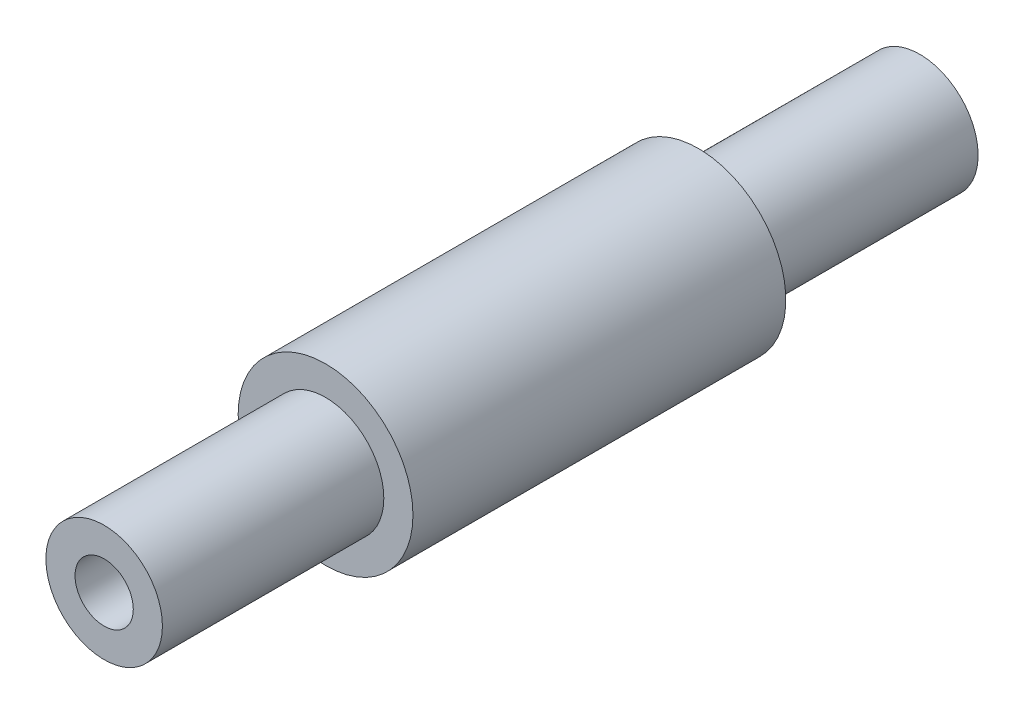
ISO-10303-21;
HEADER;
FILE_DESCRIPTION(('STEP AP214'),'2;1');
FILE_NAME('part.step','',(''),(''),'','','');
FILE_SCHEMA(('AUTOMOTIVE_DESIGN { 1 0 10303 214 1 1 1 1 }'));
ENDSEC;
DATA;
#1=APPLICATION_CONTEXT('core data for automotive mechanical design processes');
#2=APPLICATION_PROTOCOL_DEFINITION('international standard','automotive_design',2000,#1);
#3=PRODUCT_CONTEXT('',#1,'mechanical');
#4=PRODUCT('Part','Part','',(#3));
#5=PRODUCT_RELATED_PRODUCT_CATEGORY('part','',(#4));
#6=PRODUCT_DEFINITION_FORMATION('','',#4);
#7=PRODUCT_DEFINITION_CONTEXT('part definition',#1,'design');
#8=PRODUCT_DEFINITION('design','',#6,#7);
#9=PRODUCT_DEFINITION_SHAPE('','',#8);
#10=(LENGTH_UNIT() NAMED_UNIT(*) SI_UNIT(.MILLI.,.METRE.));
#11=(NAMED_UNIT(*) PLANE_ANGLE_UNIT() SI_UNIT($,.RADIAN.));
#12=(NAMED_UNIT(*) SI_UNIT($,.STERADIAN.) SOLID_ANGLE_UNIT());
#13=UNCERTAINTY_MEASURE_WITH_UNIT(LENGTH_MEASURE(1.E-05),#10,'distance_accuracy_value','');
#14=(GEOMETRIC_REPRESENTATION_CONTEXT(3) GLOBAL_UNCERTAINTY_ASSIGNED_CONTEXT((#13)) GLOBAL_UNIT_ASSIGNED_CONTEXT((#10,
#11,#12)) REPRESENTATION_CONTEXT('',''));
#15=CARTESIAN_POINT('',(0.,0.,0.));
#16=DIRECTION('',(0.,0.,1.));
#17=DIRECTION('',(1.,0.,0.));
#18=AXIS2_PLACEMENT_3D('',#15,#16,#17);
#19=CARTESIAN_POINT('',(0.,0.,70.));
#20=DIRECTION('',(0.,0.,-1.));
#21=DIRECTION('',(-1.,0.,0.));
#22=AXIS2_PLACEMENT_3D('',#19,#20,#21);
#23=CYLINDRICAL_SURFACE('',#22,7.5);
#24=CARTESIAN_POINT('',(0.,0.,19.));
#25=DIRECTION('',(0.,0.,-1.));
#26=DIRECTION('',(-1.,0.,0.));
#27=AXIS2_PLACEMENT_3D('',#24,#25,#26);
#28=CIRCLE('',#27,7.5);
#29=CARTESIAN_POINT('',(-7.5,0.,19.));
#30=VERTEX_POINT('',#29);
#31=EDGE_CURVE('E10',#30,#30,#28,.T.);
#32=ORIENTED_EDGE('',*,*,#31,.F.);
#33=EDGE_LOOP('',(#32));
#34=FACE_BOUND('',#33,.T.);
#35=CARTESIAN_POINT('',(0.,0.,51.));
#36=DIRECTION('',(0.,0.,1.));
#37=DIRECTION('',(1.,0.,0.));
#38=AXIS2_PLACEMENT_3D('',#35,#36,#37);
#39=CIRCLE('',#38,7.5);
#40=CARTESIAN_POINT('',(7.5,0.,51.));
#41=VERTEX_POINT('',#40);
#42=EDGE_CURVE('E34',#41,#41,#39,.T.);
#43=ORIENTED_EDGE('',*,*,#42,.F.);
#44=EDGE_LOOP('',(#43));
#45=FACE_BOUND('',#44,.T.);
#46=ADVANCED_FACE('F31',(#34,#45),#23,.T.);
#47=CARTESIAN_POINT('',(0.,0.,19.));
#48=DIRECTION('',(0.,0.,-1.));
#49=DIRECTION('',(-1.,0.,0.));
#50=AXIS2_PLACEMENT_3D('',#47,#48,#49);
#51=PLANE('',#50);
#52=CARTESIAN_POINT('',(0.,0.,19.));
#53=DIRECTION('',(0.,0.,-1.));
#54=DIRECTION('',(-1.,0.,0.));
#55=AXIS2_PLACEMENT_3D('',#52,#53,#54);
#56=CIRCLE('',#55,5.);
#57=CARTESIAN_POINT('',(-5.,0.,19.));
#58=VERTEX_POINT('',#57);
#59=EDGE_CURVE('E38',#58,#58,#56,.T.);
#60=ORIENTED_EDGE('',*,*,#59,.F.);
#61=EDGE_LOOP('',(#60));
#62=FACE_BOUND('',#61,.T.);
#63=ORIENTED_EDGE('',*,*,#31,.T.);
#64=EDGE_LOOP('',(#63));
#65=FACE_BOUND('',#64,.T.);
#66=ADVANCED_FACE('F83',(#62,#65),#51,.T.);
#67=CARTESIAN_POINT('',(0.,0.,19.));
#68=DIRECTION('',(0.,0.,-1.));
#69=DIRECTION('',(-1.,0.,0.));
#70=AXIS2_PLACEMENT_3D('',#67,#68,#69);
#71=CYLINDRICAL_SURFACE('',#70,5.);
#72=ORIENTED_EDGE('',*,*,#59,.T.);
#73=EDGE_LOOP('',(#72));
#74=FACE_BOUND('',#73,.T.);
#75=CARTESIAN_POINT('',(0.,0.,0.));
#76=DIRECTION('',(0.,0.,-1.));
#77=DIRECTION('',(-1.,0.,0.));
#78=AXIS2_PLACEMENT_3D('',#75,#76,#77);
#79=CIRCLE('',#78,5.);
#80=CARTESIAN_POINT('',(-5.,0.,0.));
#81=VERTEX_POINT('',#80);
#82=EDGE_CURVE('E42',#81,#81,#79,.T.);
#83=ORIENTED_EDGE('',*,*,#82,.F.);
#84=EDGE_LOOP('',(#83));
#85=FACE_BOUND('',#84,.T.);
#86=ADVANCED_FACE('F79',(#74,#85),#71,.T.);
#87=CARTESIAN_POINT('',(0.,0.,0.));
#88=DIRECTION('',(0.,0.,1.));
#89=DIRECTION('',(1.,0.,0.));
#90=AXIS2_PLACEMENT_3D('',#87,#88,#89);
#91=PLANE('',#90);
#92=CARTESIAN_POINT('',(0.,0.,0.));
#93=DIRECTION('',(0.,0.,-1.));
#94=DIRECTION('',(-1.,0.,0.));
#95=AXIS2_PLACEMENT_3D('',#92,#93,#94);
#96=CIRCLE('',#95,2.5);
#97=CARTESIAN_POINT('',(-2.5,0.,0.));
#98=VERTEX_POINT('',#97);
#99=EDGE_CURVE('E60',#98,#98,#96,.T.);
#100=ORIENTED_EDGE('',*,*,#99,.F.);
#101=EDGE_LOOP('',(#100));
#102=FACE_BOUND('',#101,.T.);
#103=ORIENTED_EDGE('',*,*,#82,.T.);
#104=EDGE_LOOP('',(#103));
#105=FACE_BOUND('',#104,.T.);
#106=ADVANCED_FACE('F75',(#102,#105),#91,.F.);
#107=CARTESIAN_POINT('',(0.,0.,51.));
#108=DIRECTION('',(0.,0.,1.));
#109=DIRECTION('',(1.,0.,0.));
#110=AXIS2_PLACEMENT_3D('',#107,#108,#109);
#111=PLANE('',#110);
#112=CARTESIAN_POINT('',(0.,0.,51.));
#113=DIRECTION('',(0.,0.,1.));
#114=DIRECTION('',(1.,0.,0.));
#115=AXIS2_PLACEMENT_3D('',#112,#113,#114);
#116=CIRCLE('',#115,5.);
#117=CARTESIAN_POINT('',(5.,0.,51.));
#118=VERTEX_POINT('',#117);
#119=EDGE_CURVE('E50',#118,#118,#116,.T.);
#120=ORIENTED_EDGE('',*,*,#119,.F.);
#121=EDGE_LOOP('',(#120));
#122=FACE_BOUND('',#121,.T.);
#123=ORIENTED_EDGE('',*,*,#42,.T.);
#124=EDGE_LOOP('',(#123));
#125=FACE_BOUND('',#124,.T.);
#126=ADVANCED_FACE('F78',(#122,#125),#111,.T.);
#127=CARTESIAN_POINT('',(0.,0.,51.));
#128=DIRECTION('',(0.,0.,1.));
#129=DIRECTION('',(1.,0.,0.));
#130=AXIS2_PLACEMENT_3D('',#127,#128,#129);
#131=CYLINDRICAL_SURFACE('',#130,5.);
#132=ORIENTED_EDGE('',*,*,#119,.T.);
#133=EDGE_LOOP('',(#132));
#134=FACE_BOUND('',#133,.T.);
#135=CARTESIAN_POINT('',(0.,0.,70.));
#136=DIRECTION('',(0.,0.,1.));
#137=DIRECTION('',(1.,0.,0.));
#138=AXIS2_PLACEMENT_3D('',#135,#136,#137);
#139=CIRCLE('',#138,5.);
#140=CARTESIAN_POINT('',(5.,0.,70.));
#141=VERTEX_POINT('',#140);
#142=EDGE_CURVE('E47',#141,#141,#139,.T.);
#143=ORIENTED_EDGE('',*,*,#142,.F.);
#144=EDGE_LOOP('',(#143));
#145=FACE_BOUND('',#144,.T.);
#146=ADVANCED_FACE('F102',(#134,#145),#131,.T.);
#147=CARTESIAN_POINT('',(0.,0.,70.));
#148=DIRECTION('',(0.,0.,1.));
#149=DIRECTION('',(1.,0.,0.));
#150=AXIS2_PLACEMENT_3D('',#147,#148,#149);
#151=PLANE('',#150);
#152=CARTESIAN_POINT('',(0.,0.,70.));
#153=DIRECTION('',(0.,0.,1.));
#154=DIRECTION('',(1.,0.,0.));
#155=AXIS2_PLACEMENT_3D('',#152,#153,#154);
#156=CIRCLE('',#155,2.5);
#157=CARTESIAN_POINT('',(2.5,0.,70.));
#158=VERTEX_POINT('',#157);
#159=EDGE_CURVE('E54',#158,#158,#156,.T.);
#160=ORIENTED_EDGE('',*,*,#159,.F.);
#161=EDGE_LOOP('',(#160));
#162=FACE_BOUND('',#161,.T.);
#163=ORIENTED_EDGE('',*,*,#142,.T.);
#164=EDGE_LOOP('',(#163));
#165=FACE_BOUND('',#164,.T.);
#166=ADVANCED_FACE('F107',(#162,#165),#151,.T.);
#167=CARTESIAN_POINT('',(0.,0.,60.));
#168=DIRECTION('',(0.,0.,1.));
#169=DIRECTION('',(1.,0.,0.));
#170=AXIS2_PLACEMENT_3D('',#167,#168,#169);
#171=CYLINDRICAL_SURFACE('',#170,2.5);
#172=CARTESIAN_POINT('',(0.,0.,60.));
#173=DIRECTION('',(0.,0.,1.));
#174=DIRECTION('',(1.,0.,0.));
#175=AXIS2_PLACEMENT_3D('',#172,#173,#174);
#176=CIRCLE('',#175,2.5);
#177=CARTESIAN_POINT('',(2.5,0.,60.));
#178=VERTEX_POINT('',#177);
#179=EDGE_CURVE('E51',#178,#178,#176,.T.);
#180=ORIENTED_EDGE('',*,*,#179,.F.);
#181=EDGE_LOOP('',(#180));
#182=FACE_BOUND('',#181,.T.);
#183=ORIENTED_EDGE('',*,*,#159,.T.);
#184=EDGE_LOOP('',(#183));
#185=FACE_BOUND('',#184,.T.);
#186=ADVANCED_FACE('F112',(#182,#185),#171,.F.);
#187=CARTESIAN_POINT('',(0.,0.,60.));
#188=DIRECTION('',(0.,0.,1.));
#189=DIRECTION('',(1.,0.,0.));
#190=AXIS2_PLACEMENT_3D('',#187,#188,#189);
#191=PLANE('',#190);
#192=ORIENTED_EDGE('',*,*,#179,.T.);
#193=EDGE_LOOP('',(#192));
#194=FACE_BOUND('',#193,.T.);
#195=ADVANCED_FACE('F71',(#194),#191,.T.);
#196=CARTESIAN_POINT('',(0.,0.,10.));
#197=DIRECTION('',(0.,0.,-1.));
#198=DIRECTION('',(-1.,0.,0.));
#199=AXIS2_PLACEMENT_3D('',#196,#197,#198);
#200=CYLINDRICAL_SURFACE('',#199,2.5);
#201=CARTESIAN_POINT('',(0.,0.,10.));
#202=DIRECTION('',(0.,0.,-1.));
#203=DIRECTION('',(-1.,0.,0.));
#204=AXIS2_PLACEMENT_3D('',#201,#202,#203);
#205=CIRCLE('',#204,2.5);
#206=CARTESIAN_POINT('',(-2.5,0.,10.));
#207=VERTEX_POINT('',#206);
#208=EDGE_CURVE('E57',#207,#207,#205,.T.);
#209=ORIENTED_EDGE('',*,*,#208,.F.);
#210=EDGE_LOOP('',(#209));
#211=FACE_BOUND('',#210,.T.);
#212=ORIENTED_EDGE('',*,*,#99,.T.);
#213=EDGE_LOOP('',(#212));
#214=FACE_BOUND('',#213,.T.);
#215=ADVANCED_FACE('F68',(#211,#214),#200,.F.);
#216=CARTESIAN_POINT('',(0.,0.,10.));
#217=DIRECTION('',(0.,0.,-1.));
#218=DIRECTION('',(-1.,0.,0.));
#219=AXIS2_PLACEMENT_3D('',#216,#217,#218);
#220=PLANE('',#219);
#221=ORIENTED_EDGE('',*,*,#208,.T.);
#222=EDGE_LOOP('',(#221));
#223=FACE_BOUND('',#222,.T.);
#224=ADVANCED_FACE('F66',(#223),#220,.T.);
#225=CLOSED_SHELL('',(#46,#66,#86,#106,#126,#146,#166,#186,#195,#215,#224));
#226=MANIFOLD_SOLID_BREP('B2',#225);
#227=ADVANCED_BREP_SHAPE_REPRESENTATION('',(#18,#226),#14);
#228=SHAPE_DEFINITION_REPRESENTATION(#9,#227);
ENDSEC;
END-ISO-10303-21;
